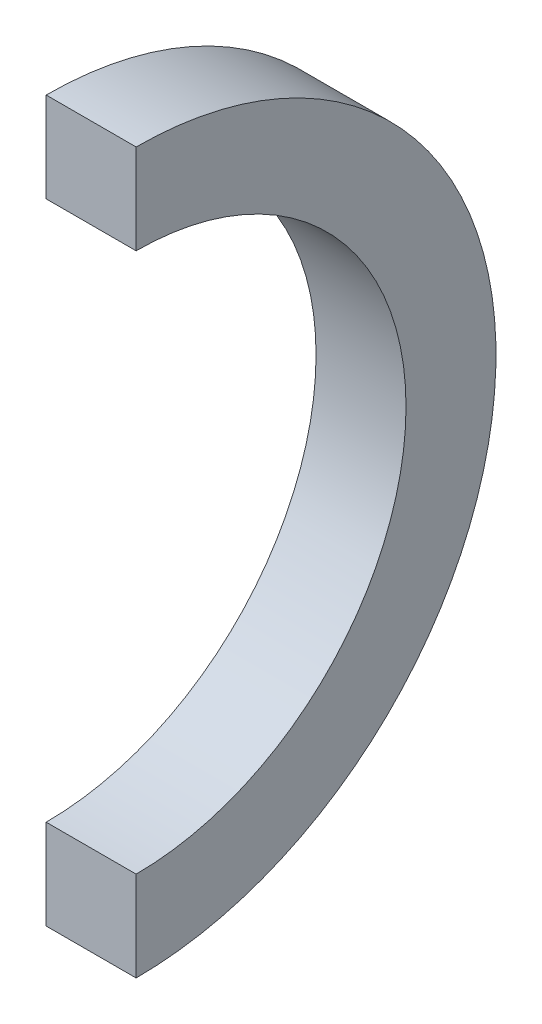
ISO-10303-21;
HEADER;
FILE_DESCRIPTION(('STEP AP214'),'2;1');
FILE_NAME('part.step','',(''),(''),'','','');
FILE_SCHEMA(('AUTOMOTIVE_DESIGN { 1 0 10303 214 1 1 1 1 }'));
ENDSEC;
DATA;
#1=APPLICATION_CONTEXT('core data for automotive mechanical design processes');
#2=APPLICATION_PROTOCOL_DEFINITION('international standard','automotive_design',2000,#1);
#3=PRODUCT_CONTEXT('',#1,'mechanical');
#4=PRODUCT('Part','Part','',(#3));
#5=PRODUCT_RELATED_PRODUCT_CATEGORY('part','',(#4));
#6=PRODUCT_DEFINITION_FORMATION('','',#4);
#7=PRODUCT_DEFINITION_CONTEXT('part definition',#1,'design');
#8=PRODUCT_DEFINITION('design','',#6,#7);
#9=PRODUCT_DEFINITION_SHAPE('','',#8);
#10=(LENGTH_UNIT() NAMED_UNIT(*) SI_UNIT(.MILLI.,.METRE.));
#11=(NAMED_UNIT(*) PLANE_ANGLE_UNIT() SI_UNIT($,.RADIAN.));
#12=(NAMED_UNIT(*) SI_UNIT($,.STERADIAN.) SOLID_ANGLE_UNIT());
#13=UNCERTAINTY_MEASURE_WITH_UNIT(LENGTH_MEASURE(1.E-05),#10,'distance_accuracy_value','');
#14=(GEOMETRIC_REPRESENTATION_CONTEXT(3) GLOBAL_UNCERTAINTY_ASSIGNED_CONTEXT((#13)) GLOBAL_UNIT_ASSIGNED_CONTEXT((#10,
#11,#12)) REPRESENTATION_CONTEXT('',''));
#15=CARTESIAN_POINT('',(0.,0.,0.));
#16=DIRECTION('',(0.,0.,1.));
#17=DIRECTION('',(1.,0.,0.));
#18=AXIS2_PLACEMENT_3D('',#15,#16,#17);
#19=CARTESIAN_POINT('',(0.,203.2,7.09469008052925E-13));
#20=DIRECTION('',(1.,0.,0.));
#21=DIRECTION('',(0.,0.,-1.));
#22=AXIS2_PLACEMENT_3D('',#19,#20,#21);
#23=PLANE('',#22);
#24=CARTESIAN_POINT('',(0.,101.6,0.));
#25=DIRECTION('',(-1.,0.,0.));
#26=DIRECTION('',(0.,0.,1.));
#27=AXIS2_PLACEMENT_3D('',#24,#25,#26);
#28=CIRCLE('',#27,76.2);
#29=CARTESIAN_POINT('',(0.,177.8,5.32101756039694E-13));
#30=VERTEX_POINT('',#29);
#31=CARTESIAN_POINT('',(0.,25.4,0.));
#32=VERTEX_POINT('',#31);
#33=EDGE_CURVE('E11',#30,#32,#28,.T.);
#34=ORIENTED_EDGE('',*,*,#33,.T.);
#35=DIRECTION('',(0.,1.,0.));
#36=VECTOR('',#35,1.);
#37=CARTESIAN_POINT('',(0.,0.,0.));
#38=LINE('',#37,#36);
#39=CARTESIAN_POINT('',(0.,0.,0.));
#40=VERTEX_POINT('',#39);
#41=EDGE_CURVE('E80',#40,#32,#38,.T.);
#42=ORIENTED_EDGE('',*,*,#41,.F.);
#43=CARTESIAN_POINT('',(0.,101.6,0.));
#44=DIRECTION('',(-1.,0.,0.));
#45=DIRECTION('',(0.,0.,1.));
#46=AXIS2_PLACEMENT_3D('',#43,#44,#45);
#47=CIRCLE('',#46,101.6);
#48=CARTESIAN_POINT('',(0.,203.2,7.09469008052925E-13));
#49=VERTEX_POINT('',#48);
#50=EDGE_CURVE('E55',#49,#40,#47,.T.);
#51=ORIENTED_EDGE('',*,*,#50,.F.);
#52=DIRECTION('',(0.,-1.,0.));
#53=VECTOR('',#52,1.);
#54=CARTESIAN_POINT('',(0.,203.2,7.09469008052925E-13));
#55=LINE('',#54,#53);
#56=EDGE_CURVE('E82',#49,#30,#55,.T.);
#57=ORIENTED_EDGE('',*,*,#56,.T.);
#58=EDGE_LOOP('',(#34,#42,#51,#57));
#59=FACE_BOUND('',#58,.T.);
#60=ADVANCED_FACE('F39',(#59),#23,.T.);
#61=CARTESIAN_POINT('',(-25.4,101.6,0.));
#62=DIRECTION('',(-1.,0.,0.));
#63=DIRECTION('',(0.,0.,1.));
#64=AXIS2_PLACEMENT_3D('',#61,#62,#63);
#65=CYLINDRICAL_SURFACE('',#64,76.2);
#66=CARTESIAN_POINT('',(-25.4,101.6,0.));
#67=DIRECTION('',(-1.,0.,0.));
#68=DIRECTION('',(0.,0.,1.));
#69=AXIS2_PLACEMENT_3D('',#66,#67,#68);
#70=CIRCLE('',#69,76.2);
#71=CARTESIAN_POINT('',(-25.4,177.8,5.32101756039694E-13));
#72=VERTEX_POINT('',#71);
#73=CARTESIAN_POINT('',(-25.4,25.4,0.));
#74=VERTEX_POINT('',#73);
#75=EDGE_CURVE('E48',#72,#74,#70,.T.);
#76=ORIENTED_EDGE('',*,*,#75,.T.);
#77=DIRECTION('',(-1.,0.,0.));
#78=VECTOR('',#77,1.);
#79=CARTESIAN_POINT('',(0.,25.4,0.));
#80=LINE('',#79,#78);
#81=EDGE_CURVE('E91',#32,#74,#80,.T.);
#82=ORIENTED_EDGE('',*,*,#81,.F.);
#83=ORIENTED_EDGE('',*,*,#33,.F.);
#84=DIRECTION('',(-1.,0.,0.));
#85=VECTOR('',#84,1.);
#86=CARTESIAN_POINT('',(0.,177.8,5.32101756039694E-13));
#87=LINE('',#86,#85);
#88=EDGE_CURVE('E106',#30,#72,#87,.T.);
#89=ORIENTED_EDGE('',*,*,#88,.T.);
#90=EDGE_LOOP('',(#76,#82,#83,#89));
#91=FACE_BOUND('',#90,.T.);
#92=ADVANCED_FACE('F41',(#91),#65,.F.);
#93=CARTESIAN_POINT('',(-25.4,203.2,7.09469008052925E-13));
#94=DIRECTION('',(-1.,0.,0.));
#95=DIRECTION('',(0.,0.,1.));
#96=AXIS2_PLACEMENT_3D('',#93,#94,#95);
#97=PLANE('',#96);
#98=CARTESIAN_POINT('',(-25.4,101.6,0.));
#99=DIRECTION('',(-1.,0.,0.));
#100=DIRECTION('',(0.,0.,1.));
#101=AXIS2_PLACEMENT_3D('',#98,#99,#100);
#102=CIRCLE('',#101,101.6);
#103=CARTESIAN_POINT('',(-25.4,203.2,7.09469008052925E-13));
#104=VERTEX_POINT('',#103);
#105=CARTESIAN_POINT('',(-25.4,0.,0.));
#106=VERTEX_POINT('',#105);
#107=EDGE_CURVE('E63',#104,#106,#102,.T.);
#108=ORIENTED_EDGE('',*,*,#107,.T.);
#109=DIRECTION('',(0.,-1.,0.));
#110=VECTOR('',#109,1.);
#111=CARTESIAN_POINT('',(-25.4,0.,0.));
#112=LINE('',#111,#110);
#113=EDGE_CURVE('E97',#74,#106,#112,.T.);
#114=ORIENTED_EDGE('',*,*,#113,.F.);
#115=ORIENTED_EDGE('',*,*,#75,.F.);
#116=DIRECTION('',(0.,1.,0.));
#117=VECTOR('',#116,1.);
#118=CARTESIAN_POINT('',(-25.4,203.2,7.09469008052925E-13));
#119=LINE('',#118,#117);
#120=EDGE_CURVE('E109',#72,#104,#119,.T.);
#121=ORIENTED_EDGE('',*,*,#120,.T.);
#122=EDGE_LOOP('',(#108,#114,#115,#121));
#123=FACE_BOUND('',#122,.T.);
#124=ADVANCED_FACE('F120',(#123),#97,.T.);
#125=CARTESIAN_POINT('',(-25.4,101.6,0.));
#126=DIRECTION('',(-1.,0.,0.));
#127=DIRECTION('',(0.,0.,1.));
#128=AXIS2_PLACEMENT_3D('',#125,#126,#127);
#129=CYLINDRICAL_SURFACE('',#128,101.6);
#130=DIRECTION('',(1.,0.,0.));
#131=VECTOR('',#130,1.);
#132=CARTESIAN_POINT('',(0.,203.2,7.09469008052925E-13));
#133=LINE('',#132,#131);
#134=EDGE_CURVE('E112',#104,#49,#133,.T.);
#135=ORIENTED_EDGE('',*,*,#134,.T.);
#136=ORIENTED_EDGE('',*,*,#50,.T.);
#137=DIRECTION('',(1.,0.,0.));
#138=VECTOR('',#137,1.);
#139=CARTESIAN_POINT('',(0.,0.,0.));
#140=LINE('',#139,#138);
#141=EDGE_CURVE('E93',#106,#40,#140,.T.);
#142=ORIENTED_EDGE('',*,*,#141,.F.);
#143=ORIENTED_EDGE('',*,*,#107,.F.);
#144=EDGE_LOOP('',(#135,#136,#142,#143));
#145=FACE_BOUND('',#144,.T.);
#146=ADVANCED_FACE('F123',(#145),#129,.T.);
#147=CARTESIAN_POINT('',(0.,203.2,7.09469008052925E-13));
#148=DIRECTION('',(0.,0.,-1.));
#149=DIRECTION('',(1.,0.,0.));
#150=AXIS2_PLACEMENT_3D('',#147,#148,#149);
#151=PLANE('',#150);
#152=ORIENTED_EDGE('',*,*,#56,.F.);
#153=ORIENTED_EDGE('',*,*,#134,.F.);
#154=ORIENTED_EDGE('',*,*,#120,.F.);
#155=ORIENTED_EDGE('',*,*,#88,.F.);
#156=EDGE_LOOP('',(#152,#153,#154,#155));
#157=FACE_BOUND('',#156,.T.);
#158=ADVANCED_FACE('F125',(#157),#151,.F.);
#159=CARTESIAN_POINT('',(0.,0.,0.));
#160=DIRECTION('',(0.,0.,1.));
#161=DIRECTION('',(1.,0.,0.));
#162=AXIS2_PLACEMENT_3D('',#159,#160,#161);
#163=PLANE('',#162);
#164=ORIENTED_EDGE('',*,*,#41,.T.);
#165=ORIENTED_EDGE('',*,*,#81,.T.);
#166=ORIENTED_EDGE('',*,*,#113,.T.);
#167=ORIENTED_EDGE('',*,*,#141,.T.);
#168=EDGE_LOOP('',(#164,#165,#166,#167));
#169=FACE_BOUND('',#168,.T.);
#170=ADVANCED_FACE('F89',(#169),#163,.T.);
#171=CLOSED_SHELL('',(#60,#92,#124,#146,#158,#170));
#172=MANIFOLD_SOLID_BREP('B2',#171);
#173=ADVANCED_BREP_SHAPE_REPRESENTATION('',(#18,#172),#14);
#174=SHAPE_DEFINITION_REPRESENTATION(#9,#173);
ENDSEC;
END-ISO-10303-21;
